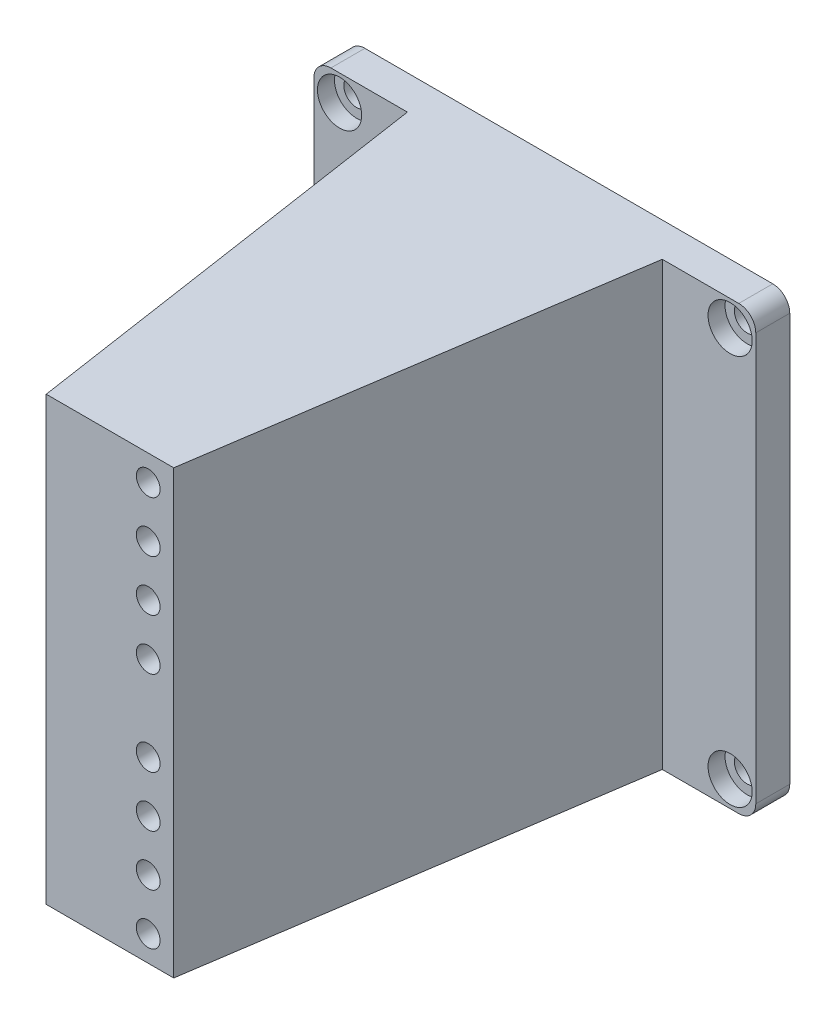
ISO-10303-21;
HEADER;
FILE_DESCRIPTION(('STEP AP214'),'2;1');
FILE_NAME('part.step','',(''),(''),'','','');
FILE_SCHEMA(('AUTOMOTIVE_DESIGN { 1 0 10303 214 1 1 1 1 }'));
ENDSEC;
DATA;
#1=APPLICATION_CONTEXT('core data for automotive mechanical design processes');
#2=APPLICATION_PROTOCOL_DEFINITION('international standard','automotive_design',2000,#1);
#3=PRODUCT_CONTEXT('',#1,'mechanical');
#4=PRODUCT('Part','Part','',(#3));
#5=PRODUCT_RELATED_PRODUCT_CATEGORY('part','',(#4));
#6=PRODUCT_DEFINITION_FORMATION('','',#4);
#7=PRODUCT_DEFINITION_CONTEXT('part definition',#1,'design');
#8=PRODUCT_DEFINITION('design','',#6,#7);
#9=PRODUCT_DEFINITION_SHAPE('','',#8);
#10=(LENGTH_UNIT() NAMED_UNIT(*) SI_UNIT(.MILLI.,.METRE.));
#11=(NAMED_UNIT(*) PLANE_ANGLE_UNIT() SI_UNIT($,.RADIAN.));
#12=(NAMED_UNIT(*) SI_UNIT($,.STERADIAN.) SOLID_ANGLE_UNIT());
#13=UNCERTAINTY_MEASURE_WITH_UNIT(LENGTH_MEASURE(1.E-05),#10,'distance_accuracy_value','');
#14=(GEOMETRIC_REPRESENTATION_CONTEXT(3) GLOBAL_UNCERTAINTY_ASSIGNED_CONTEXT((#13)) GLOBAL_UNIT_ASSIGNED_CONTEXT((#10,
#11,#12)) REPRESENTATION_CONTEXT('',''));
#15=CARTESIAN_POINT('',(0.,0.,0.));
#16=DIRECTION('',(0.,0.,1.));
#17=DIRECTION('',(1.,0.,0.));
#18=AXIS2_PLACEMENT_3D('',#15,#16,#17);
#19=CARTESIAN_POINT('',(48.9809703885631,48.9809703885634,-6.));
#20=DIRECTION('',(0.,0.,1.));
#21=DIRECTION('',(1.,0.,0.));
#22=AXIS2_PLACEMENT_3D('',#19,#20,#21);
#23=CYLINDRICAL_SURFACE('',#22,1.5);
#24=CARTESIAN_POINT('',(48.9809703885631,48.9809703885634,-4.));
#25=DIRECTION('',(0.,0.,1.));
#26=DIRECTION('',(1.,0.,0.));
#27=AXIS2_PLACEMENT_3D('',#24,#25,#26);
#28=CIRCLE('',#27,1.5);
#29=CARTESIAN_POINT('',(50.4809703885631,48.9809703885634,-4.));
#30=VERTEX_POINT('',#29);
#31=EDGE_CURVE('E186',#30,#30,#28,.T.);
#32=ORIENTED_EDGE('',*,*,#31,.F.);
#33=EDGE_LOOP('',(#32));
#34=FACE_BOUND('',#33,.T.);
#35=CARTESIAN_POINT('',(48.9809703885631,48.9809703885634,-2.));
#36=DIRECTION('',(0.,0.,1.));
#37=DIRECTION('',(1.,0.,0.));
#38=AXIS2_PLACEMENT_3D('',#35,#36,#37);
#39=CIRCLE('',#38,1.5);
#40=CARTESIAN_POINT('',(50.4809703885631,48.9809703885634,-2.));
#41=VERTEX_POINT('',#40);
#42=EDGE_CURVE('E183',#41,#41,#39,.F.);
#43=ORIENTED_EDGE('',*,*,#42,.F.);
#44=EDGE_LOOP('',(#43));
#45=FACE_BOUND('',#44,.T.);
#46=ADVANCED_FACE('F37',(#34,#45),#23,.F.);
#47=CARTESIAN_POINT('',(48.9809703885642,3.01902961143773,-6.));
#48=DIRECTION('',(0.,0.,1.));
#49=DIRECTION('',(1.,0.,0.));
#50=AXIS2_PLACEMENT_3D('',#47,#48,#49);
#51=CYLINDRICAL_SURFACE('',#50,1.50000000000001);
#52=CARTESIAN_POINT('',(48.9809703885642,3.01902961143773,-4.));
#53=DIRECTION('',(0.,0.,1.));
#54=DIRECTION('',(1.,0.,0.));
#55=AXIS2_PLACEMENT_3D('',#52,#53,#54);
#56=CIRCLE('',#55,1.50000000000001);
#57=CARTESIAN_POINT('',(50.4809703885642,3.01902961143773,-4.));
#58=VERTEX_POINT('',#57);
#59=EDGE_CURVE('E169',#58,#58,#56,.T.);
#60=ORIENTED_EDGE('',*,*,#59,.F.);
#61=EDGE_LOOP('',(#60));
#62=FACE_BOUND('',#61,.T.);
#63=CARTESIAN_POINT('',(48.9809703885642,3.01902961143773,-2.));
#64=DIRECTION('',(0.,0.,1.));
#65=DIRECTION('',(1.,0.,0.));
#66=AXIS2_PLACEMENT_3D('',#63,#64,#65);
#67=CIRCLE('',#66,1.50000000000001);
#68=CARTESIAN_POINT('',(50.4809703885642,3.01902961143773,-2.));
#69=VERTEX_POINT('',#68);
#70=EDGE_CURVE('E180',#69,#69,#67,.F.);
#71=ORIENTED_EDGE('',*,*,#70,.F.);
#72=EDGE_LOOP('',(#71));
#73=FACE_BOUND('',#72,.T.);
#74=ADVANCED_FACE('F382',(#62,#73),#51,.F.);
#75=CARTESIAN_POINT('',(3.01902961143773,48.9809703885624,-6.));
#76=DIRECTION('',(0.,0.,1.));
#77=DIRECTION('',(1.,0.,0.));
#78=AXIS2_PLACEMENT_3D('',#75,#76,#77);
#79=CYLINDRICAL_SURFACE('',#78,1.5);
#80=CARTESIAN_POINT('',(3.01902961143773,48.9809703885624,-4.));
#81=DIRECTION('',(0.,0.,1.));
#82=DIRECTION('',(1.,0.,0.));
#83=AXIS2_PLACEMENT_3D('',#80,#81,#82);
#84=CIRCLE('',#83,1.5);
#85=CARTESIAN_POINT('',(4.51902961143773,48.9809703885624,-4.));
#86=VERTEX_POINT('',#85);
#87=EDGE_CURVE('E165',#86,#86,#84,.T.);
#88=ORIENTED_EDGE('',*,*,#87,.F.);
#89=EDGE_LOOP('',(#88));
#90=FACE_BOUND('',#89,.T.);
#91=CARTESIAN_POINT('',(3.01902961143773,48.9809703885624,-2.));
#92=DIRECTION('',(0.,0.,1.));
#93=DIRECTION('',(1.,0.,0.));
#94=AXIS2_PLACEMENT_3D('',#91,#92,#93);
#95=CIRCLE('',#94,1.5);
#96=CARTESIAN_POINT('',(4.51902961143773,48.9809703885624,-2.));
#97=VERTEX_POINT('',#96);
#98=EDGE_CURVE('E176',#97,#97,#95,.F.);
#99=ORIENTED_EDGE('',*,*,#98,.F.);
#100=EDGE_LOOP('',(#99));
#101=FACE_BOUND('',#100,.T.);
#102=ADVANCED_FACE('F388',(#90,#101),#79,.F.);
#103=CARTESIAN_POINT('',(3.01902961143856,3.01902961143677,-6.));
#104=DIRECTION('',(0.,0.,1.));
#105=DIRECTION('',(1.,0.,0.));
#106=AXIS2_PLACEMENT_3D('',#103,#104,#105);
#107=CYLINDRICAL_SURFACE('',#106,1.50000000000001);
#108=CARTESIAN_POINT('',(3.01902961143856,3.01902961143677,-4.));
#109=DIRECTION('',(0.,0.,1.));
#110=DIRECTION('',(1.,0.,0.));
#111=AXIS2_PLACEMENT_3D('',#108,#109,#110);
#112=CIRCLE('',#111,1.50000000000001);
#113=CARTESIAN_POINT('',(4.51902961143857,3.01902961143677,-4.));
#114=VERTEX_POINT('',#113);
#115=EDGE_CURVE('E168',#114,#114,#112,.T.);
#116=ORIENTED_EDGE('',*,*,#115,.F.);
#117=EDGE_LOOP('',(#116));
#118=FACE_BOUND('',#117,.T.);
#119=CARTESIAN_POINT('',(3.01902961143856,3.01902961143677,-2.));
#120=DIRECTION('',(0.,0.,1.));
#121=DIRECTION('',(1.,0.,0.));
#122=AXIS2_PLACEMENT_3D('',#119,#120,#121);
#123=CIRCLE('',#122,1.50000000000001);
#124=CARTESIAN_POINT('',(4.51902961143857,3.01902961143677,-2.));
#125=VERTEX_POINT('',#124);
#126=EDGE_CURVE('E173',#125,#125,#123,.F.);
#127=ORIENTED_EDGE('',*,*,#126,.F.);
#128=EDGE_LOOP('',(#127));
#129=FACE_BOUND('',#128,.T.);
#130=ADVANCED_FACE('F357',(#118,#129),#107,.F.);
#131=CARTESIAN_POINT('',(33.5,0.,50.));
#132=DIRECTION('',(0.,0.,-1.));
#133=DIRECTION('',(-1.,0.,0.));
#134=AXIS2_PLACEMENT_3D('',#131,#132,#133);
#135=PLANE('',#134);
#136=CARTESIAN_POINT('',(30.5,43.,50.));
#137=DIRECTION('',(0.,0.,1.));
#138=DIRECTION('',(1.,0.,0.));
#139=AXIS2_PLACEMENT_3D('',#136,#137,#138);
#140=CIRCLE('',#139,1.4);
#141=CARTESIAN_POINT('',(31.9,43.,50.));
#142=VERTEX_POINT('',#141);
#143=EDGE_CURVE('E273',#142,#142,#140,.T.);
#144=ORIENTED_EDGE('',*,*,#143,.F.);
#145=EDGE_LOOP('',(#144));
#146=FACE_BOUND('',#145,.T.);
#147=CARTESIAN_POINT('',(30.5,31.,50.));
#148=DIRECTION('',(0.,0.,1.));
#149=DIRECTION('',(1.,0.,0.));
#150=AXIS2_PLACEMENT_3D('',#147,#148,#149);
#151=CIRCLE('',#150,1.4);
#152=CARTESIAN_POINT('',(31.9,31.,50.));
#153=VERTEX_POINT('',#152);
#154=EDGE_CURVE('E285',#153,#153,#151,.T.);
#155=ORIENTED_EDGE('',*,*,#154,.F.);
#156=EDGE_LOOP('',(#155));
#157=FACE_BOUND('',#156,.T.);
#158=CARTESIAN_POINT('',(30.5,21.,50.));
#159=DIRECTION('',(0.,0.,-1.));
#160=DIRECTION('',(-1.,0.,0.));
#161=AXIS2_PLACEMENT_3D('',#158,#159,#160);
#162=CIRCLE('',#161,1.4);
#163=CARTESIAN_POINT('',(29.1,21.,50.));
#164=VERTEX_POINT('',#163);
#165=EDGE_CURVE('E291',#164,#164,#162,.T.);
#166=ORIENTED_EDGE('',*,*,#165,.T.);
#167=EDGE_LOOP('',(#166));
#168=FACE_BOUND('',#167,.T.);
#169=CARTESIAN_POINT('',(30.5,15.,50.));
#170=DIRECTION('',(0.,0.,-1.));
#171=DIRECTION('',(-1.,0.,0.));
#172=AXIS2_PLACEMENT_3D('',#169,#170,#171);
#173=CIRCLE('',#172,1.4);
#174=CARTESIAN_POINT('',(29.1,15.,50.));
#175=VERTEX_POINT('',#174);
#176=EDGE_CURVE('E297',#175,#175,#173,.T.);
#177=ORIENTED_EDGE('',*,*,#176,.T.);
#178=EDGE_LOOP('',(#177));
#179=FACE_BOUND('',#178,.T.);
#180=CARTESIAN_POINT('',(30.5,3.,50.));
#181=DIRECTION('',(0.,0.,-1.));
#182=DIRECTION('',(-1.,0.,0.));
#183=AXIS2_PLACEMENT_3D('',#180,#181,#182);
#184=CIRCLE('',#183,1.4);
#185=CARTESIAN_POINT('',(29.1,3.,50.));
#186=VERTEX_POINT('',#185);
#187=EDGE_CURVE('E262',#186,#186,#184,.T.);
#188=ORIENTED_EDGE('',*,*,#187,.T.);
#189=EDGE_LOOP('',(#188));
#190=FACE_BOUND('',#189,.T.);
#191=CARTESIAN_POINT('',(30.5,9.,50.));
#192=DIRECTION('',(0.,0.,1.));
#193=DIRECTION('',(1.,0.,0.));
#194=AXIS2_PLACEMENT_3D('',#191,#192,#193);
#195=CIRCLE('',#194,1.4);
#196=CARTESIAN_POINT('',(31.9,9.,50.));
#197=VERTEX_POINT('',#196);
#198=EDGE_CURVE('E259',#197,#197,#195,.F.);
#199=ORIENTED_EDGE('',*,*,#198,.T.);
#200=EDGE_LOOP('',(#199));
#201=FACE_BOUND('',#200,.T.);
#202=DIRECTION('',(-1.,0.,0.));
#203=VECTOR('',#202,1.);
#204=CARTESIAN_POINT('',(33.5,52.,50.));
#205=LINE('',#204,#203);
#206=CARTESIAN_POINT('',(33.5,52.,50.));
#207=VERTEX_POINT('',#206);
#208=CARTESIAN_POINT('',(18.5,52.,50.));
#209=VERTEX_POINT('',#208);
#210=EDGE_CURVE('E250',#207,#209,#205,.T.);
#211=ORIENTED_EDGE('',*,*,#210,.T.);
#212=DIRECTION('',(0.,1.,0.));
#213=VECTOR('',#212,1.);
#214=CARTESIAN_POINT('',(18.5,0.,50.));
#215=LINE('',#214,#213);
#216=CARTESIAN_POINT('',(18.5,0.,50.));
#217=VERTEX_POINT('',#216);
#218=EDGE_CURVE('E242',#217,#209,#215,.T.);
#219=ORIENTED_EDGE('',*,*,#218,.F.);
#220=DIRECTION('',(-1.,0.,0.));
#221=VECTOR('',#220,1.);
#222=CARTESIAN_POINT('',(33.5,0.,50.));
#223=LINE('',#222,#221);
#224=CARTESIAN_POINT('',(33.5,0.,50.));
#225=VERTEX_POINT('',#224);
#226=EDGE_CURVE('E136',#225,#217,#223,.T.);
#227=ORIENTED_EDGE('',*,*,#226,.F.);
#228=DIRECTION('',(0.,1.,0.));
#229=VECTOR('',#228,1.);
#230=CARTESIAN_POINT('',(33.5,0.,50.));
#231=LINE('',#230,#229);
#232=EDGE_CURVE('E132',#225,#207,#231,.T.);
#233=ORIENTED_EDGE('',*,*,#232,.T.);
#234=EDGE_LOOP('',(#211,#219,#227,#233));
#235=FACE_BOUND('',#234,.T.);
#236=CARTESIAN_POINT('',(30.5,37.,50.));
#237=DIRECTION('',(0.,0.,1.));
#238=DIRECTION('',(1.,0.,0.));
#239=AXIS2_PLACEMENT_3D('',#236,#237,#238);
#240=CIRCLE('',#239,1.4);
#241=CARTESIAN_POINT('',(31.9,37.,50.));
#242=VERTEX_POINT('',#241);
#243=EDGE_CURVE('E279',#242,#242,#240,.T.);
#244=ORIENTED_EDGE('',*,*,#243,.F.);
#245=EDGE_LOOP('',(#244));
#246=FACE_BOUND('',#245,.T.);
#247=CARTESIAN_POINT('',(30.5,49.,50.));
#248=DIRECTION('',(0.,0.,1.));
#249=DIRECTION('',(1.,0.,0.));
#250=AXIS2_PLACEMENT_3D('',#247,#248,#249);
#251=CIRCLE('',#250,1.4);
#252=CARTESIAN_POINT('',(31.9,49.,50.));
#253=VERTEX_POINT('',#252);
#254=EDGE_CURVE('E267',#253,#253,#251,.T.);
#255=ORIENTED_EDGE('',*,*,#254,.F.);
#256=EDGE_LOOP('',(#255));
#257=FACE_BOUND('',#256,.T.);
#258=ADVANCED_FACE('F337',(#146,#157,#168,#179,#190,#201,#235,#246,#257),#135,.F.);
#259=CARTESIAN_POINT('',(0.,0.,0.));
#260=DIRECTION('',(0.,0.,1.));
#261=DIRECTION('',(1.,0.,0.));
#262=AXIS2_PLACEMENT_3D('',#259,#260,#261);
#263=PLANE('',#262);
#264=CARTESIAN_POINT('',(3.01902961143856,3.01902961143677,0.));
#265=DIRECTION('',(0.,0.,1.));
#266=DIRECTION('',(1.,0.,0.));
#267=AXIS2_PLACEMENT_3D('',#264,#265,#266);
#268=CIRCLE('',#267,2.6);
#269=CARTESIAN_POINT('',(5.61902961143856,3.01902961143677,0.));
#270=VERTEX_POINT('',#269);
#271=EDGE_CURVE('E324',#270,#270,#268,.T.);
#272=ORIENTED_EDGE('',*,*,#271,.F.);
#273=EDGE_LOOP('',(#272));
#274=FACE_BOUND('',#273,.T.);
#275=CARTESIAN_POINT('',(3.01902961143773,48.9809703885624,0.));
#276=DIRECTION('',(0.,0.,1.));
#277=DIRECTION('',(1.,0.,0.));
#278=AXIS2_PLACEMENT_3D('',#275,#276,#277);
#279=CIRCLE('',#278,2.6);
#280=CARTESIAN_POINT('',(5.61902961143773,48.9809703885624,0.));
#281=VERTEX_POINT('',#280);
#282=EDGE_CURVE('E312',#281,#281,#279,.T.);
#283=ORIENTED_EDGE('',*,*,#282,.F.);
#284=EDGE_LOOP('',(#283));
#285=FACE_BOUND('',#284,.T.);
#286=DIRECTION('',(0.,1.,0.));
#287=VECTOR('',#286,1.);
#288=CARTESIAN_POINT('',(0.,0.,0.));
#289=LINE('',#288,#287);
#290=CARTESIAN_POINT('',(0.,2.,0.));
#291=VERTEX_POINT('',#290);
#292=CARTESIAN_POINT('',(0.,50.,0.));
#293=VERTEX_POINT('',#292);
#294=EDGE_CURVE('E162',#291,#293,#289,.T.);
#295=ORIENTED_EDGE('',*,*,#294,.F.);
#296=CARTESIAN_POINT('',(2.,2.,0.));
#297=DIRECTION('',(0.,0.,1.));
#298=DIRECTION('',(1.,0.,0.));
#299=AXIS2_PLACEMENT_3D('',#296,#297,#298);
#300=CIRCLE('',#299,2.);
#301=CARTESIAN_POINT('',(2.,0.,0.));
#302=VERTEX_POINT('',#301);
#303=EDGE_CURVE('E213',#291,#302,#300,.T.);
#304=ORIENTED_EDGE('',*,*,#303,.T.);
#305=DIRECTION('',(1.,0.,0.));
#306=VECTOR('',#305,1.);
#307=CARTESIAN_POINT('',(0.,0.,0.));
#308=LINE('',#307,#306);
#309=CARTESIAN_POINT('',(11.,0.,0.));
#310=VERTEX_POINT('',#309);
#311=EDGE_CURVE('E151',#302,#310,#308,.T.);
#312=ORIENTED_EDGE('',*,*,#311,.T.);
#313=DIRECTION('',(0.,1.,0.));
#314=VECTOR('',#313,1.);
#315=CARTESIAN_POINT('',(11.,0.,0.));
#316=LINE('',#315,#314);
#317=CARTESIAN_POINT('',(11.,52.,0.));
#318=VERTEX_POINT('',#317);
#319=EDGE_CURVE('E244',#310,#318,#316,.T.);
#320=ORIENTED_EDGE('',*,*,#319,.T.);
#321=DIRECTION('',(1.,0.,0.));
#322=VECTOR('',#321,1.);
#323=CARTESIAN_POINT('',(0.,52.,0.));
#324=LINE('',#323,#322);
#325=CARTESIAN_POINT('',(1.99999999999999,52.,0.));
#326=VERTEX_POINT('',#325);
#327=EDGE_CURVE('E160',#326,#318,#324,.T.);
#328=ORIENTED_EDGE('',*,*,#327,.F.);
#329=CARTESIAN_POINT('',(1.99999999999999,50.,0.));
#330=DIRECTION('',(0.,0.,1.));
#331=DIRECTION('',(1.,0.,0.));
#332=AXIS2_PLACEMENT_3D('',#329,#330,#331);
#333=CIRCLE('',#332,2.);
#334=EDGE_CURVE('E52',#326,#293,#333,.T.);
#335=ORIENTED_EDGE('',*,*,#334,.T.);
#336=EDGE_LOOP('',(#295,#304,#312,#320,#328,#335));
#337=FACE_BOUND('',#336,.T.);
#338=ADVANCED_FACE('F335',(#274,#285,#337),#263,.T.);
#339=CARTESIAN_POINT('',(0.,0.,-4.));
#340=DIRECTION('',(0.,-1.,0.));
#341=DIRECTION('',(1.,0.,0.));
#342=AXIS2_PLACEMENT_3D('',#339,#340,#341);
#343=PLANE('',#342);
#344=DIRECTION('',(1.,0.,0.));
#345=VECTOR('',#344,1.);
#346=CARTESIAN_POINT('',(0.,0.,-4.));
#347=LINE('',#346,#345);
#348=CARTESIAN_POINT('',(2.,0.,-4.));
#349=VERTEX_POINT('',#348);
#350=CARTESIAN_POINT('',(50.,0.,-4.));
#351=VERTEX_POINT('',#350);
#352=EDGE_CURVE('E164',#349,#351,#347,.T.);
#353=ORIENTED_EDGE('',*,*,#352,.T.);
#354=DIRECTION('',(0.,0.,1.));
#355=VECTOR('',#354,1.);
#356=CARTESIAN_POINT('',(50.,0.,-4.));
#357=LINE('',#356,#355);
#358=CARTESIAN_POINT('',(50.,0.,0.));
#359=VERTEX_POINT('',#358);
#360=EDGE_CURVE('E150',#351,#359,#357,.T.);
#361=ORIENTED_EDGE('',*,*,#360,.T.);
#362=CARTESIAN_POINT('',(41.,0.,0.));
#363=VERTEX_POINT('',#362);
#364=EDGE_CURVE('E142',#363,#359,#308,.T.);
#365=ORIENTED_EDGE('',*,*,#364,.F.);
#366=DIRECTION('',(-0.148340452930244,0.,0.988936352868297));
#367=VECTOR('',#366,1.);
#368=CARTESIAN_POINT('',(41.,0.,0.));
#369=LINE('',#368,#367);
#370=EDGE_CURVE('E126',#363,#225,#369,.T.);
#371=ORIENTED_EDGE('',*,*,#370,.T.);
#372=ORIENTED_EDGE('',*,*,#226,.T.);
#373=DIRECTION('',(0.148340452930245,0.,0.988936352868298));
#374=VECTOR('',#373,1.);
#375=CARTESIAN_POINT('',(11.,0.,0.));
#376=LINE('',#375,#374);
#377=EDGE_CURVE('E247',#310,#217,#376,.T.);
#378=ORIENTED_EDGE('',*,*,#377,.F.);
#379=ORIENTED_EDGE('',*,*,#311,.F.);
#380=DIRECTION('',(0.,0.,1.));
#381=VECTOR('',#380,1.);
#382=CARTESIAN_POINT('',(2.,0.,-4.));
#383=LINE('',#382,#381);
#384=EDGE_CURVE('E187',#302,#349,#383,.F.);
#385=ORIENTED_EDGE('',*,*,#384,.T.);
#386=EDGE_LOOP('',(#353,#361,#365,#371,#372,#378,#379,#385));
#387=FACE_BOUND('',#386,.T.);
#388=ADVANCED_FACE('F148',(#387),#343,.T.);
#389=CARTESIAN_POINT('',(0.,0.,-4.));
#390=DIRECTION('',(1.,0.,0.));
#391=DIRECTION('',(0.,1.,0.));
#392=AXIS2_PLACEMENT_3D('',#389,#390,#391);
#393=PLANE('',#392);
#394=DIRECTION('',(0.,1.,0.));
#395=VECTOR('',#394,1.);
#396=CARTESIAN_POINT('',(0.,0.,-4.));
#397=LINE('',#396,#395);
#398=CARTESIAN_POINT('',(0.,2.,-4.));
#399=VERTEX_POINT('',#398);
#400=CARTESIAN_POINT('',(0.,50.,-4.));
#401=VERTEX_POINT('',#400);
#402=EDGE_CURVE('E156',#399,#401,#397,.T.);
#403=ORIENTED_EDGE('',*,*,#402,.F.);
#404=DIRECTION('',(0.,0.,1.));
#405=VECTOR('',#404,1.);
#406=CARTESIAN_POINT('',(0.,2.,0.));
#407=LINE('',#406,#405);
#408=EDGE_CURVE('E209',#399,#291,#407,.T.);
#409=ORIENTED_EDGE('',*,*,#408,.T.);
#410=ORIENTED_EDGE('',*,*,#294,.T.);
#411=DIRECTION('',(0.,0.,1.));
#412=VECTOR('',#411,1.);
#413=CARTESIAN_POINT('',(0.,50.,-4.));
#414=LINE('',#413,#412);
#415=EDGE_CURVE('E207',#293,#401,#414,.F.);
#416=ORIENTED_EDGE('',*,*,#415,.T.);
#417=EDGE_LOOP('',(#403,#409,#410,#416));
#418=FACE_BOUND('',#417,.T.);
#419=ADVANCED_FACE('F343',(#418),#393,.F.);
#420=CARTESIAN_POINT('',(0.,52.,-4.));
#421=DIRECTION('',(0.,-1.,0.));
#422=DIRECTION('',(1.,0.,0.));
#423=AXIS2_PLACEMENT_3D('',#420,#421,#422);
#424=PLANE('',#423);
#425=DIRECTION('',(1.,0.,0.));
#426=VECTOR('',#425,1.);
#427=CARTESIAN_POINT('',(0.,52.,-4.));
#428=LINE('',#427,#426);
#429=CARTESIAN_POINT('',(1.99999999999999,52.,-4.));
#430=VERTEX_POINT('',#429);
#431=CARTESIAN_POINT('',(50.,52.,-4.));
#432=VERTEX_POINT('',#431);
#433=EDGE_CURVE('E219',#430,#432,#428,.T.);
#434=ORIENTED_EDGE('',*,*,#433,.F.);
#435=DIRECTION('',(0.,0.,1.));
#436=VECTOR('',#435,1.);
#437=CARTESIAN_POINT('',(1.99999999999999,52.,-4.));
#438=LINE('',#437,#436);
#439=EDGE_CURVE('E11',#430,#326,#438,.T.);
#440=ORIENTED_EDGE('',*,*,#439,.T.);
#441=ORIENTED_EDGE('',*,*,#327,.T.);
#442=DIRECTION('',(0.148340452930245,0.,0.988936352868298));
#443=VECTOR('',#442,1.);
#444=CARTESIAN_POINT('',(11.,52.,0.));
#445=LINE('',#444,#443);
#446=EDGE_CURVE('E137',#318,#209,#445,.T.);
#447=ORIENTED_EDGE('',*,*,#446,.T.);
#448=ORIENTED_EDGE('',*,*,#210,.F.);
#449=DIRECTION('',(-0.148340452930244,0.,0.988936352868297));
#450=VECTOR('',#449,1.);
#451=CARTESIAN_POINT('',(41.,52.,0.));
#452=LINE('',#451,#450);
#453=CARTESIAN_POINT('',(41.,52.,0.));
#454=VERTEX_POINT('',#453);
#455=EDGE_CURVE('E253',#454,#207,#452,.T.);
#456=ORIENTED_EDGE('',*,*,#455,.F.);
#457=CARTESIAN_POINT('',(50.,52.,0.));
#458=VERTEX_POINT('',#457);
#459=EDGE_CURVE('E144',#454,#458,#324,.T.);
#460=ORIENTED_EDGE('',*,*,#459,.T.);
#461=DIRECTION('',(0.,0.,1.));
#462=VECTOR('',#461,1.);
#463=CARTESIAN_POINT('',(50.,52.,-4.));
#464=LINE('',#463,#462);
#465=EDGE_CURVE('E45',#458,#432,#464,.F.);
#466=ORIENTED_EDGE('',*,*,#465,.T.);
#467=EDGE_LOOP('',(#434,#440,#441,#447,#448,#456,#460,#466));
#468=FACE_BOUND('',#467,.T.);
#469=ADVANCED_FACE('F218',(#468),#424,.F.);
#470=CARTESIAN_POINT('',(52.,0.,-4.));
#471=DIRECTION('',(1.,0.,0.));
#472=DIRECTION('',(0.,0.,-1.));
#473=AXIS2_PLACEMENT_3D('',#470,#471,#472);
#474=PLANE('',#473);
#475=DIRECTION('',(0.,1.,0.));
#476=VECTOR('',#475,1.);
#477=CARTESIAN_POINT('',(52.,0.,0.));
#478=LINE('',#477,#476);
#479=CARTESIAN_POINT('',(52.,2.00000000000001,0.));
#480=VERTEX_POINT('',#479);
#481=CARTESIAN_POINT('',(52.,50.,0.));
#482=VERTEX_POINT('',#481);
#483=EDGE_CURVE('E153',#480,#482,#478,.T.);
#484=ORIENTED_EDGE('',*,*,#483,.F.);
#485=DIRECTION('',(0.,0.,1.));
#486=VECTOR('',#485,1.);
#487=CARTESIAN_POINT('',(52.,2.00000000000001,-4.));
#488=LINE('',#487,#486);
#489=CARTESIAN_POINT('',(52.,2.00000000000001,-4.));
#490=VERTEX_POINT('',#489);
#491=EDGE_CURVE('E197',#480,#490,#488,.F.);
#492=ORIENTED_EDGE('',*,*,#491,.T.);
#493=DIRECTION('',(0.,1.,0.));
#494=VECTOR('',#493,1.);
#495=CARTESIAN_POINT('',(52.,0.,-4.));
#496=LINE('',#495,#494);
#497=CARTESIAN_POINT('',(52.,50.,-4.));
#498=VERTEX_POINT('',#497);
#499=EDGE_CURVE('E228',#490,#498,#496,.T.);
#500=ORIENTED_EDGE('',*,*,#499,.T.);
#501=DIRECTION('',(0.,0.,1.));
#502=VECTOR('',#501,1.);
#503=CARTESIAN_POINT('',(52.,50.,0.));
#504=LINE('',#503,#502);
#505=EDGE_CURVE('E194',#498,#482,#504,.T.);
#506=ORIENTED_EDGE('',*,*,#505,.T.);
#507=EDGE_LOOP('',(#484,#492,#500,#506));
#508=FACE_BOUND('',#507,.T.);
#509=ADVANCED_FACE('F232',(#508),#474,.T.);
#510=CARTESIAN_POINT('',(0.,0.,-4.));
#511=DIRECTION('',(0.,0.,1.));
#512=DIRECTION('',(1.,0.,0.));
#513=AXIS2_PLACEMENT_3D('',#510,#511,#512);
#514=PLANE('',#513);
#515=ORIENTED_EDGE('',*,*,#115,.T.);
#516=EDGE_LOOP('',(#515));
#517=FACE_BOUND('',#516,.T.);
#518=ORIENTED_EDGE('',*,*,#59,.T.);
#519=EDGE_LOOP('',(#518));
#520=FACE_BOUND('',#519,.T.);
#521=ORIENTED_EDGE('',*,*,#31,.T.);
#522=EDGE_LOOP('',(#521));
#523=FACE_BOUND('',#522,.T.);
#524=ORIENTED_EDGE('',*,*,#87,.T.);
#525=EDGE_LOOP('',(#524));
#526=FACE_BOUND('',#525,.T.);
#527=ORIENTED_EDGE('',*,*,#499,.F.);
#528=CARTESIAN_POINT('',(50.,2.00000000000001,-4.));
#529=DIRECTION('',(0.,0.,1.));
#530=DIRECTION('',(1.,0.,0.));
#531=AXIS2_PLACEMENT_3D('',#528,#529,#530);
#532=CIRCLE('',#531,2.);
#533=EDGE_CURVE('E205',#490,#351,#532,.F.);
#534=ORIENTED_EDGE('',*,*,#533,.T.);
#535=ORIENTED_EDGE('',*,*,#352,.F.);
#536=CARTESIAN_POINT('',(2.,2.,-4.));
#537=DIRECTION('',(0.,0.,1.));
#538=DIRECTION('',(1.,0.,0.));
#539=AXIS2_PLACEMENT_3D('',#536,#537,#538);
#540=CIRCLE('',#539,2.);
#541=EDGE_CURVE('E203',#349,#399,#540,.F.);
#542=ORIENTED_EDGE('',*,*,#541,.T.);
#543=ORIENTED_EDGE('',*,*,#402,.T.);
#544=CARTESIAN_POINT('',(1.99999999999999,50.,-4.));
#545=DIRECTION('',(0.,0.,1.));
#546=DIRECTION('',(1.,0.,0.));
#547=AXIS2_PLACEMENT_3D('',#544,#545,#546);
#548=CIRCLE('',#547,2.);
#549=EDGE_CURVE('E201',#401,#430,#548,.F.);
#550=ORIENTED_EDGE('',*,*,#549,.T.);
#551=ORIENTED_EDGE('',*,*,#433,.T.);
#552=CARTESIAN_POINT('',(50.,50.,-4.));
#553=DIRECTION('',(0.,0.,1.));
#554=DIRECTION('',(1.,0.,0.));
#555=AXIS2_PLACEMENT_3D('',#552,#553,#554);
#556=CIRCLE('',#555,2.);
#557=EDGE_CURVE('E199',#432,#498,#556,.F.);
#558=ORIENTED_EDGE('',*,*,#557,.T.);
#559=EDGE_LOOP('',(#527,#534,#535,#542,#543,#550,#551,#558));
#560=FACE_BOUND('',#559,.T.);
#561=ADVANCED_FACE('F224',(#517,#520,#523,#526,#560),#514,.F.);
#562=CARTESIAN_POINT('',(48.9809703885642,3.01902961143773,0.));
#563=DIRECTION('',(0.,0.,1.));
#564=DIRECTION('',(1.,0.,0.));
#565=AXIS2_PLACEMENT_3D('',#562,#563,#564);
#566=CIRCLE('',#565,2.6);
#567=CARTESIAN_POINT('',(51.5809703885642,3.01902961143773,0.));
#568=VERTEX_POINT('',#567);
#569=EDGE_CURVE('E318',#568,#568,#566,.T.);
#570=ORIENTED_EDGE('',*,*,#569,.F.);
#571=EDGE_LOOP('',(#570));
#572=FACE_BOUND('',#571,.T.);
#573=CARTESIAN_POINT('',(48.9809703885631,48.9809703885634,0.));
#574=DIRECTION('',(0.,0.,1.));
#575=DIRECTION('',(1.,0.,0.));
#576=AXIS2_PLACEMENT_3D('',#573,#574,#575);
#577=CIRCLE('',#576,2.6);
#578=CARTESIAN_POINT('',(51.5809703885631,48.9809703885634,0.));
#579=VERTEX_POINT('',#578);
#580=EDGE_CURVE('E309',#579,#579,#577,.T.);
#581=ORIENTED_EDGE('',*,*,#580,.F.);
#582=EDGE_LOOP('',(#581));
#583=FACE_BOUND('',#582,.T.);
#584=ORIENTED_EDGE('',*,*,#364,.T.);
#585=CARTESIAN_POINT('',(50.,2.00000000000001,0.));
#586=DIRECTION('',(0.,0.,1.));
#587=DIRECTION('',(1.,0.,0.));
#588=AXIS2_PLACEMENT_3D('',#585,#586,#587);
#589=CIRCLE('',#588,2.);
#590=EDGE_CURVE('E192',#359,#480,#589,.T.);
#591=ORIENTED_EDGE('',*,*,#590,.T.);
#592=ORIENTED_EDGE('',*,*,#483,.T.);
#593=CARTESIAN_POINT('',(50.,50.,0.));
#594=DIRECTION('',(0.,0.,1.));
#595=DIRECTION('',(1.,0.,0.));
#596=AXIS2_PLACEMENT_3D('',#593,#594,#595);
#597=CIRCLE('',#596,2.);
#598=EDGE_CURVE('E190',#482,#458,#597,.T.);
#599=ORIENTED_EDGE('',*,*,#598,.T.);
#600=ORIENTED_EDGE('',*,*,#459,.F.);
#601=DIRECTION('',(0.,1.,0.));
#602=VECTOR('',#601,1.);
#603=CARTESIAN_POINT('',(41.,0.,0.));
#604=LINE('',#603,#602);
#605=EDGE_CURVE('E129',#363,#454,#604,.T.);
#606=ORIENTED_EDGE('',*,*,#605,.F.);
#607=EDGE_LOOP('',(#584,#591,#592,#599,#600,#606));
#608=FACE_BOUND('',#607,.T.);
#609=ADVANCED_FACE('F141',(#572,#583,#608),#263,.T.);
#610=CARTESIAN_POINT('',(41.,0.,0.));
#611=DIRECTION('',(-0.988936352868297,0.,-0.148340452930244));
#612=DIRECTION('',(-0.148340452930244,0.,0.988936352868298));
#613=AXIS2_PLACEMENT_3D('',#610,#611,#612);
#614=PLANE('',#613);
#615=ORIENTED_EDGE('',*,*,#455,.T.);
#616=ORIENTED_EDGE('',*,*,#232,.F.);
#617=ORIENTED_EDGE('',*,*,#370,.F.);
#618=ORIENTED_EDGE('',*,*,#605,.T.);
#619=EDGE_LOOP('',(#615,#616,#617,#618));
#620=FACE_BOUND('',#619,.T.);
#621=ADVANCED_FACE('F128',(#620),#614,.F.);
#622=CARTESIAN_POINT('',(11.,0.,0.));
#623=DIRECTION('',(-0.988936352868298,0.,0.148340452930245));
#624=DIRECTION('',(0.148340452930245,0.,0.988936352868298));
#625=AXIS2_PLACEMENT_3D('',#622,#623,#624);
#626=PLANE('',#625);
#627=ORIENTED_EDGE('',*,*,#446,.F.);
#628=ORIENTED_EDGE('',*,*,#319,.F.);
#629=ORIENTED_EDGE('',*,*,#377,.T.);
#630=ORIENTED_EDGE('',*,*,#218,.T.);
#631=EDGE_LOOP('',(#627,#628,#629,#630));
#632=FACE_BOUND('',#631,.T.);
#633=ADVANCED_FACE('F350',(#632),#626,.T.);
#634=CARTESIAN_POINT('',(30.5,9.,44.));
#635=DIRECTION('',(0.,0.,1.));
#636=DIRECTION('',(1.,0.,0.));
#637=AXIS2_PLACEMENT_3D('',#634,#635,#636);
#638=CYLINDRICAL_SURFACE('',#637,1.4);
#639=CARTESIAN_POINT('',(30.5,9.,44.));
#640=DIRECTION('',(0.,0.,1.));
#641=DIRECTION('',(1.,0.,0.));
#642=AXIS2_PLACEMENT_3D('',#639,#640,#641);
#643=CIRCLE('',#642,1.4);
#644=CARTESIAN_POINT('',(31.9,9.,44.));
#645=VERTEX_POINT('',#644);
#646=EDGE_CURVE('E255',#645,#645,#643,.F.);
#647=ORIENTED_EDGE('',*,*,#646,.T.);
#648=EDGE_LOOP('',(#647));
#649=FACE_BOUND('',#648,.T.);
#650=ORIENTED_EDGE('',*,*,#198,.F.);
#651=EDGE_LOOP('',(#650));
#652=FACE_BOUND('',#651,.T.);
#653=ADVANCED_FACE('F462',(#649,#652),#638,.F.);
#654=CARTESIAN_POINT('',(0.,0.,44.));
#655=DIRECTION('',(0.,0.,1.));
#656=DIRECTION('',(1.,0.,0.));
#657=AXIS2_PLACEMENT_3D('',#654,#655,#656);
#658=PLANE('',#657);
#659=ORIENTED_EDGE('',*,*,#646,.F.);
#660=EDGE_LOOP('',(#659));
#661=FACE_BOUND('',#660,.T.);
#662=ADVANCED_FACE('F407',(#661),#658,.T.);
#663=CARTESIAN_POINT('',(30.5,3.,44.));
#664=DIRECTION('',(0.,0.,1.));
#665=DIRECTION('',(1.,0.,0.));
#666=AXIS2_PLACEMENT_3D('',#663,#664,#665);
#667=CYLINDRICAL_SURFACE('',#666,1.4);
#668=CARTESIAN_POINT('',(30.5,3.,44.));
#669=DIRECTION('',(0.,0.,-1.));
#670=DIRECTION('',(-1.,0.,0.));
#671=AXIS2_PLACEMENT_3D('',#668,#669,#670);
#672=CIRCLE('',#671,1.4);
#673=CARTESIAN_POINT('',(29.1,3.,44.));
#674=VERTEX_POINT('',#673);
#675=EDGE_CURVE('E300',#674,#674,#672,.T.);
#676=ORIENTED_EDGE('',*,*,#675,.T.);
#677=EDGE_LOOP('',(#676));
#678=FACE_BOUND('',#677,.T.);
#679=ORIENTED_EDGE('',*,*,#187,.F.);
#680=EDGE_LOOP('',(#679));
#681=FACE_BOUND('',#680,.T.);
#682=ADVANCED_FACE('F403',(#678,#681),#667,.F.);
#683=CARTESIAN_POINT('',(30.5,3.,44.));
#684=DIRECTION('',(0.,0.,-1.));
#685=DIRECTION('',(-1.,0.,0.));
#686=AXIS2_PLACEMENT_3D('',#683,#684,#685);
#687=PLANE('',#686);
#688=ORIENTED_EDGE('',*,*,#675,.F.);
#689=EDGE_LOOP('',(#688));
#690=FACE_BOUND('',#689,.T.);
#691=ADVANCED_FACE('F406',(#690),#687,.F.);
#692=CARTESIAN_POINT('',(30.5,15.,44.));
#693=DIRECTION('',(0.,0.,1.));
#694=DIRECTION('',(1.,0.,0.));
#695=AXIS2_PLACEMENT_3D('',#692,#693,#694);
#696=CYLINDRICAL_SURFACE('',#695,1.4);
#697=CARTESIAN_POINT('',(30.5,15.,44.));
#698=DIRECTION('',(0.,0.,-1.));
#699=DIRECTION('',(-1.,0.,0.));
#700=AXIS2_PLACEMENT_3D('',#697,#698,#699);
#701=CIRCLE('',#700,1.4);
#702=CARTESIAN_POINT('',(29.1,15.,44.));
#703=VERTEX_POINT('',#702);
#704=EDGE_CURVE('E294',#703,#703,#701,.T.);
#705=ORIENTED_EDGE('',*,*,#704,.T.);
#706=EDGE_LOOP('',(#705));
#707=FACE_BOUND('',#706,.T.);
#708=ORIENTED_EDGE('',*,*,#176,.F.);
#709=EDGE_LOOP('',(#708));
#710=FACE_BOUND('',#709,.T.);
#711=ADVANCED_FACE('F411',(#707,#710),#696,.F.);
#712=CARTESIAN_POINT('',(30.5,15.,44.));
#713=DIRECTION('',(0.,0.,-1.));
#714=DIRECTION('',(-1.,0.,0.));
#715=AXIS2_PLACEMENT_3D('',#712,#713,#714);
#716=PLANE('',#715);
#717=ORIENTED_EDGE('',*,*,#704,.F.);
#718=EDGE_LOOP('',(#717));
#719=FACE_BOUND('',#718,.T.);
#720=ADVANCED_FACE('F415',(#719),#716,.F.);
#721=CARTESIAN_POINT('',(30.5,21.,44.));
#722=DIRECTION('',(0.,0.,1.));
#723=DIRECTION('',(1.,0.,0.));
#724=AXIS2_PLACEMENT_3D('',#721,#722,#723);
#725=CYLINDRICAL_SURFACE('',#724,1.4);
#726=CARTESIAN_POINT('',(30.5,21.,44.));
#727=DIRECTION('',(0.,0.,-1.));
#728=DIRECTION('',(-1.,0.,0.));
#729=AXIS2_PLACEMENT_3D('',#726,#727,#728);
#730=CIRCLE('',#729,1.4);
#731=CARTESIAN_POINT('',(29.1,21.,44.));
#732=VERTEX_POINT('',#731);
#733=EDGE_CURVE('E288',#732,#732,#730,.T.);
#734=ORIENTED_EDGE('',*,*,#733,.T.);
#735=EDGE_LOOP('',(#734));
#736=FACE_BOUND('',#735,.T.);
#737=ORIENTED_EDGE('',*,*,#165,.F.);
#738=EDGE_LOOP('',(#737));
#739=FACE_BOUND('',#738,.T.);
#740=ADVANCED_FACE('F419',(#736,#739),#725,.F.);
#741=CARTESIAN_POINT('',(30.5,21.,44.));
#742=DIRECTION('',(0.,0.,-1.));
#743=DIRECTION('',(-1.,0.,0.));
#744=AXIS2_PLACEMENT_3D('',#741,#742,#743);
#745=PLANE('',#744);
#746=ORIENTED_EDGE('',*,*,#733,.F.);
#747=EDGE_LOOP('',(#746));
#748=FACE_BOUND('',#747,.T.);
#749=ADVANCED_FACE('F423',(#748),#745,.F.);
#750=CARTESIAN_POINT('',(30.5,31.,44.));
#751=DIRECTION('',(0.,0.,1.));
#752=DIRECTION('',(1.,0.,0.));
#753=AXIS2_PLACEMENT_3D('',#750,#751,#752);
#754=CYLINDRICAL_SURFACE('',#753,1.4);
#755=CARTESIAN_POINT('',(30.5,31.,44.));
#756=DIRECTION('',(0.,0.,1.));
#757=DIRECTION('',(1.,0.,0.));
#758=AXIS2_PLACEMENT_3D('',#755,#756,#757);
#759=CIRCLE('',#758,1.4);
#760=CARTESIAN_POINT('',(31.9,31.,44.));
#761=VERTEX_POINT('',#760);
#762=EDGE_CURVE('E282',#761,#761,#759,.T.);
#763=ORIENTED_EDGE('',*,*,#762,.F.);
#764=EDGE_LOOP('',(#763));
#765=FACE_BOUND('',#764,.T.);
#766=ORIENTED_EDGE('',*,*,#154,.T.);
#767=EDGE_LOOP('',(#766));
#768=FACE_BOUND('',#767,.T.);
#769=ADVANCED_FACE('F427',(#765,#768),#754,.F.);
#770=CARTESIAN_POINT('',(30.5,31.,44.));
#771=DIRECTION('',(0.,0.,1.));
#772=DIRECTION('',(1.,0.,0.));
#773=AXIS2_PLACEMENT_3D('',#770,#771,#772);
#774=PLANE('',#773);
#775=ORIENTED_EDGE('',*,*,#762,.T.);
#776=EDGE_LOOP('',(#775));
#777=FACE_BOUND('',#776,.T.);
#778=ADVANCED_FACE('F431',(#777),#774,.T.);
#779=CARTESIAN_POINT('',(30.5,37.,44.));
#780=DIRECTION('',(0.,0.,1.));
#781=DIRECTION('',(1.,0.,0.));
#782=AXIS2_PLACEMENT_3D('',#779,#780,#781);
#783=CYLINDRICAL_SURFACE('',#782,1.4);
#784=CARTESIAN_POINT('',(30.5,37.,44.));
#785=DIRECTION('',(0.,0.,1.));
#786=DIRECTION('',(1.,0.,0.));
#787=AXIS2_PLACEMENT_3D('',#784,#785,#786);
#788=CIRCLE('',#787,1.4);
#789=CARTESIAN_POINT('',(31.9,37.,44.));
#790=VERTEX_POINT('',#789);
#791=EDGE_CURVE('E276',#790,#790,#788,.T.);
#792=ORIENTED_EDGE('',*,*,#791,.F.);
#793=EDGE_LOOP('',(#792));
#794=FACE_BOUND('',#793,.T.);
#795=ORIENTED_EDGE('',*,*,#243,.T.);
#796=EDGE_LOOP('',(#795));
#797=FACE_BOUND('',#796,.T.);
#798=ADVANCED_FACE('F435',(#794,#797),#783,.F.);
#799=CARTESIAN_POINT('',(30.5,37.,44.));
#800=DIRECTION('',(0.,0.,1.));
#801=DIRECTION('',(1.,0.,0.));
#802=AXIS2_PLACEMENT_3D('',#799,#800,#801);
#803=PLANE('',#802);
#804=ORIENTED_EDGE('',*,*,#791,.T.);
#805=EDGE_LOOP('',(#804));
#806=FACE_BOUND('',#805,.T.);
#807=ADVANCED_FACE('F439',(#806),#803,.T.);
#808=CARTESIAN_POINT('',(30.5,43.,44.));
#809=DIRECTION('',(0.,0.,1.));
#810=DIRECTION('',(1.,0.,0.));
#811=AXIS2_PLACEMENT_3D('',#808,#809,#810);
#812=CYLINDRICAL_SURFACE('',#811,1.4);
#813=CARTESIAN_POINT('',(30.5,43.,44.));
#814=DIRECTION('',(0.,0.,1.));
#815=DIRECTION('',(1.,0.,0.));
#816=AXIS2_PLACEMENT_3D('',#813,#814,#815);
#817=CIRCLE('',#816,1.4);
#818=CARTESIAN_POINT('',(31.9,43.,44.));
#819=VERTEX_POINT('',#818);
#820=EDGE_CURVE('E270',#819,#819,#817,.T.);
#821=ORIENTED_EDGE('',*,*,#820,.F.);
#822=EDGE_LOOP('',(#821));
#823=FACE_BOUND('',#822,.T.);
#824=ORIENTED_EDGE('',*,*,#143,.T.);
#825=EDGE_LOOP('',(#824));
#826=FACE_BOUND('',#825,.T.);
#827=ADVANCED_FACE('F377',(#823,#826),#812,.F.);
#828=CARTESIAN_POINT('',(30.5,43.,44.));
#829=DIRECTION('',(0.,0.,1.));
#830=DIRECTION('',(1.,0.,0.));
#831=AXIS2_PLACEMENT_3D('',#828,#829,#830);
#832=PLANE('',#831);
#833=ORIENTED_EDGE('',*,*,#820,.T.);
#834=EDGE_LOOP('',(#833));
#835=FACE_BOUND('',#834,.T.);
#836=ADVANCED_FACE('F367',(#835),#832,.T.);
#837=CARTESIAN_POINT('',(30.5,49.,44.));
#838=DIRECTION('',(0.,0.,1.));
#839=DIRECTION('',(1.,0.,0.));
#840=AXIS2_PLACEMENT_3D('',#837,#838,#839);
#841=CYLINDRICAL_SURFACE('',#840,1.4);
#842=CARTESIAN_POINT('',(30.5,49.,44.));
#843=DIRECTION('',(0.,0.,1.));
#844=DIRECTION('',(1.,0.,0.));
#845=AXIS2_PLACEMENT_3D('',#842,#843,#844);
#846=CIRCLE('',#845,1.4);
#847=CARTESIAN_POINT('',(31.9,49.,44.));
#848=VERTEX_POINT('',#847);
#849=EDGE_CURVE('E172',#848,#848,#846,.T.);
#850=ORIENTED_EDGE('',*,*,#849,.F.);
#851=EDGE_LOOP('',(#850));
#852=FACE_BOUND('',#851,.T.);
#853=ORIENTED_EDGE('',*,*,#254,.T.);
#854=EDGE_LOOP('',(#853));
#855=FACE_BOUND('',#854,.T.);
#856=ADVANCED_FACE('F364',(#852,#855),#841,.F.);
#857=CARTESIAN_POINT('',(30.5,49.,44.));
#858=DIRECTION('',(0.,0.,1.));
#859=DIRECTION('',(1.,0.,0.));
#860=AXIS2_PLACEMENT_3D('',#857,#858,#859);
#861=PLANE('',#860);
#862=ORIENTED_EDGE('',*,*,#849,.T.);
#863=EDGE_LOOP('',(#862));
#864=FACE_BOUND('',#863,.T.);
#865=ADVANCED_FACE('F366',(#864),#861,.T.);
#866=CARTESIAN_POINT('',(3.01902961143856,3.01902961143677,-2.));
#867=DIRECTION('',(0.,0.,1.));
#868=DIRECTION('',(1.,0.,0.));
#869=AXIS2_PLACEMENT_3D('',#866,#867,#868);
#870=PLANE('',#869);
#871=CARTESIAN_POINT('',(3.01902961143856,3.01902961143677,-2.));
#872=DIRECTION('',(0.,0.,1.));
#873=DIRECTION('',(1.,0.,0.));
#874=AXIS2_PLACEMENT_3D('',#871,#872,#873);
#875=CIRCLE('',#874,2.6);
#876=CARTESIAN_POINT('',(5.61902961143856,3.01902961143677,-2.));
#877=VERTEX_POINT('',#876);
#878=EDGE_CURVE('E321',#877,#877,#875,.T.);
#879=ORIENTED_EDGE('',*,*,#878,.T.);
#880=EDGE_LOOP('',(#879));
#881=FACE_BOUND('',#880,.T.);
#882=ORIENTED_EDGE('',*,*,#126,.T.);
#883=EDGE_LOOP('',(#882));
#884=FACE_BOUND('',#883,.T.);
#885=ADVANCED_FACE('F374',(#881,#884),#870,.T.);
#886=CARTESIAN_POINT('',(3.01902961143856,3.01902961143677,-2.));
#887=DIRECTION('',(0.,0.,1.));
#888=DIRECTION('',(1.,0.,0.));
#889=AXIS2_PLACEMENT_3D('',#886,#887,#888);
#890=CYLINDRICAL_SURFACE('',#889,2.6);
#891=ORIENTED_EDGE('',*,*,#878,.F.);
#892=EDGE_LOOP('',(#891));
#893=FACE_BOUND('',#892,.T.);
#894=ORIENTED_EDGE('',*,*,#271,.T.);
#895=EDGE_LOOP('',(#894));
#896=FACE_BOUND('',#895,.T.);
#897=ADVANCED_FACE('F609',(#893,#896),#890,.F.);
#898=CARTESIAN_POINT('',(3.01902961143773,48.9809703885624,-2.));
#899=DIRECTION('',(0.,0.,1.));
#900=DIRECTION('',(1.,0.,0.));
#901=AXIS2_PLACEMENT_3D('',#898,#899,#900);
#902=PLANE('',#901);
#903=CARTESIAN_POINT('',(3.01902961143773,48.9809703885624,-2.));
#904=DIRECTION('',(0.,0.,1.));
#905=DIRECTION('',(1.,0.,0.));
#906=AXIS2_PLACEMENT_3D('',#903,#904,#905);
#907=CIRCLE('',#906,2.6);
#908=CARTESIAN_POINT('',(5.61902961143773,48.9809703885624,-2.));
#909=VERTEX_POINT('',#908);
#910=EDGE_CURVE('E327',#909,#909,#907,.T.);
#911=ORIENTED_EDGE('',*,*,#910,.T.);
#912=EDGE_LOOP('',(#911));
#913=FACE_BOUND('',#912,.T.);
#914=ORIENTED_EDGE('',*,*,#98,.T.);
#915=EDGE_LOOP('',(#914));
#916=FACE_BOUND('',#915,.T.);
#917=ADVANCED_FACE('F598',(#913,#916),#902,.T.);
#918=CARTESIAN_POINT('',(3.01902961143773,48.9809703885624,-2.));
#919=DIRECTION('',(0.,0.,1.));
#920=DIRECTION('',(1.,0.,0.));
#921=AXIS2_PLACEMENT_3D('',#918,#919,#920);
#922=CYLINDRICAL_SURFACE('',#921,2.6);
#923=ORIENTED_EDGE('',*,*,#910,.F.);
#924=EDGE_LOOP('',(#923));
#925=FACE_BOUND('',#924,.T.);
#926=ORIENTED_EDGE('',*,*,#282,.T.);
#927=EDGE_LOOP('',(#926));
#928=FACE_BOUND('',#927,.T.);
#929=ADVANCED_FACE('F333',(#925,#928),#922,.F.);
#930=CARTESIAN_POINT('',(48.9809703885642,3.01902961143773,-2.));
#931=DIRECTION('',(0.,0.,1.));
#932=DIRECTION('',(1.,0.,0.));
#933=AXIS2_PLACEMENT_3D('',#930,#931,#932);
#934=PLANE('',#933);
#935=CARTESIAN_POINT('',(48.9809703885642,3.01902961143773,-2.));
#936=DIRECTION('',(0.,0.,1.));
#937=DIRECTION('',(1.,0.,0.));
#938=AXIS2_PLACEMENT_3D('',#935,#936,#937);
#939=CIRCLE('',#938,2.6);
#940=CARTESIAN_POINT('',(51.5809703885642,3.01902961143773,-2.));
#941=VERTEX_POINT('',#940);
#942=EDGE_CURVE('E315',#941,#941,#939,.T.);
#943=ORIENTED_EDGE('',*,*,#942,.T.);
#944=EDGE_LOOP('',(#943));
#945=FACE_BOUND('',#944,.T.);
#946=ORIENTED_EDGE('',*,*,#70,.T.);
#947=EDGE_LOOP('',(#946));
#948=FACE_BOUND('',#947,.T.);
#949=ADVANCED_FACE('F577',(#945,#948),#934,.T.);
#950=CARTESIAN_POINT('',(48.9809703885642,3.01902961143773,-2.));
#951=DIRECTION('',(0.,0.,1.));
#952=DIRECTION('',(1.,0.,0.));
#953=AXIS2_PLACEMENT_3D('',#950,#951,#952);
#954=CYLINDRICAL_SURFACE('',#953,2.6);
#955=ORIENTED_EDGE('',*,*,#942,.F.);
#956=EDGE_LOOP('',(#955));
#957=FACE_BOUND('',#956,.T.);
#958=ORIENTED_EDGE('',*,*,#569,.T.);
#959=EDGE_LOOP('',(#958));
#960=FACE_BOUND('',#959,.T.);
#961=ADVANCED_FACE('F567',(#957,#960),#954,.F.);
#962=CARTESIAN_POINT('',(48.9809703885631,48.9809703885634,-2.));
#963=DIRECTION('',(0.,0.,1.));
#964=DIRECTION('',(1.,0.,0.));
#965=AXIS2_PLACEMENT_3D('',#962,#963,#964);
#966=PLANE('',#965);
#967=CARTESIAN_POINT('',(48.9809703885631,48.9809703885634,-2.));
#968=DIRECTION('',(0.,0.,1.));
#969=DIRECTION('',(1.,0.,0.));
#970=AXIS2_PLACEMENT_3D('',#967,#968,#969);
#971=CIRCLE('',#970,2.6);
#972=CARTESIAN_POINT('',(51.5809703885631,48.9809703885634,-2.));
#973=VERTEX_POINT('',#972);
#974=EDGE_CURVE('E177',#973,#973,#971,.T.);
#975=ORIENTED_EDGE('',*,*,#974,.T.);
#976=EDGE_LOOP('',(#975));
#977=FACE_BOUND('',#976,.T.);
#978=ORIENTED_EDGE('',*,*,#42,.T.);
#979=EDGE_LOOP('',(#978));
#980=FACE_BOUND('',#979,.T.);
#981=ADVANCED_FACE('F557',(#977,#980),#966,.T.);
#982=CARTESIAN_POINT('',(48.9809703885631,48.9809703885634,-2.));
#983=DIRECTION('',(0.,0.,1.));
#984=DIRECTION('',(1.,0.,0.));
#985=AXIS2_PLACEMENT_3D('',#982,#983,#984);
#986=CYLINDRICAL_SURFACE('',#985,2.6);
#987=ORIENTED_EDGE('',*,*,#974,.F.);
#988=EDGE_LOOP('',(#987));
#989=FACE_BOUND('',#988,.T.);
#990=ORIENTED_EDGE('',*,*,#580,.T.);
#991=EDGE_LOOP('',(#990));
#992=FACE_BOUND('',#991,.T.);
#993=ADVANCED_FACE('F394',(#989,#992),#986,.F.);
#994=CARTESIAN_POINT('',(50.,2.00000000000001,-4.));
#995=DIRECTION('',(0.,0.,1.));
#996=DIRECTION('',(1.,0.,0.));
#997=AXIS2_PLACEMENT_3D('',#994,#995,#996);
#998=CYLINDRICAL_SURFACE('',#997,2.);
#999=ORIENTED_EDGE('',*,*,#533,.F.);
#1000=ORIENTED_EDGE('',*,*,#491,.F.);
#1001=ORIENTED_EDGE('',*,*,#590,.F.);
#1002=ORIENTED_EDGE('',*,*,#360,.F.);
#1003=EDGE_LOOP('',(#999,#1000,#1001,#1002));
#1004=FACE_BOUND('',#1003,.T.);
#1005=ADVANCED_FACE('F236',(#1004),#998,.T.);
#1006=CARTESIAN_POINT('',(2.,2.,-4.));
#1007=DIRECTION('',(0.,0.,-1.));
#1008=DIRECTION('',(-1.,0.,0.));
#1009=AXIS2_PLACEMENT_3D('',#1006,#1007,#1008);
#1010=CYLINDRICAL_SURFACE('',#1009,2.);
#1011=ORIENTED_EDGE('',*,*,#541,.F.);
#1012=ORIENTED_EDGE('',*,*,#384,.F.);
#1013=ORIENTED_EDGE('',*,*,#303,.F.);
#1014=ORIENTED_EDGE('',*,*,#408,.F.);
#1015=EDGE_LOOP('',(#1011,#1012,#1013,#1014));
#1016=FACE_BOUND('',#1015,.T.);
#1017=ADVANCED_FACE('F491',(#1016),#1010,.T.);
#1018=CARTESIAN_POINT('',(1.99999999999999,50.,-4.));
#1019=DIRECTION('',(0.,0.,1.));
#1020=DIRECTION('',(1.,0.,0.));
#1021=AXIS2_PLACEMENT_3D('',#1018,#1019,#1020);
#1022=CYLINDRICAL_SURFACE('',#1021,2.);
#1023=ORIENTED_EDGE('',*,*,#549,.F.);
#1024=ORIENTED_EDGE('',*,*,#415,.F.);
#1025=ORIENTED_EDGE('',*,*,#334,.F.);
#1026=ORIENTED_EDGE('',*,*,#439,.F.);
#1027=EDGE_LOOP('',(#1023,#1024,#1025,#1026));
#1028=FACE_BOUND('',#1027,.T.);
#1029=ADVANCED_FACE('F345',(#1028),#1022,.T.);
#1030=CARTESIAN_POINT('',(50.,50.,-4.));
#1031=DIRECTION('',(0.,0.,-1.));
#1032=DIRECTION('',(-1.,0.,0.));
#1033=AXIS2_PLACEMENT_3D('',#1030,#1031,#1032);
#1034=CYLINDRICAL_SURFACE('',#1033,2.);
#1035=ORIENTED_EDGE('',*,*,#557,.F.);
#1036=ORIENTED_EDGE('',*,*,#465,.F.);
#1037=ORIENTED_EDGE('',*,*,#598,.F.);
#1038=ORIENTED_EDGE('',*,*,#505,.F.);
#1039=EDGE_LOOP('',(#1035,#1036,#1037,#1038));
#1040=FACE_BOUND('',#1039,.T.);
#1041=ADVANCED_FACE('F39',(#1040),#1034,.T.);
#1042=CLOSED_SHELL('',(#46,#74,#102,#130,#258,#338,#388,#419,#469,#509,#561,#609,#621,#633,#653,
#662,#682,#691,#711,#720,#740,#749,#769,#778,#798,#807,#827,#836,#856,#865,#885,#897,#917,#929,
#949,#961,#981,#993,#1005,#1017,#1029,#1041));
#1043=MANIFOLD_SOLID_BREP('B2',#1042);
#1044=ADVANCED_BREP_SHAPE_REPRESENTATION('',(#18,#1043),#14);
#1045=SHAPE_DEFINITION_REPRESENTATION(#9,#1044);
ENDSEC;
END-ISO-10303-21;
